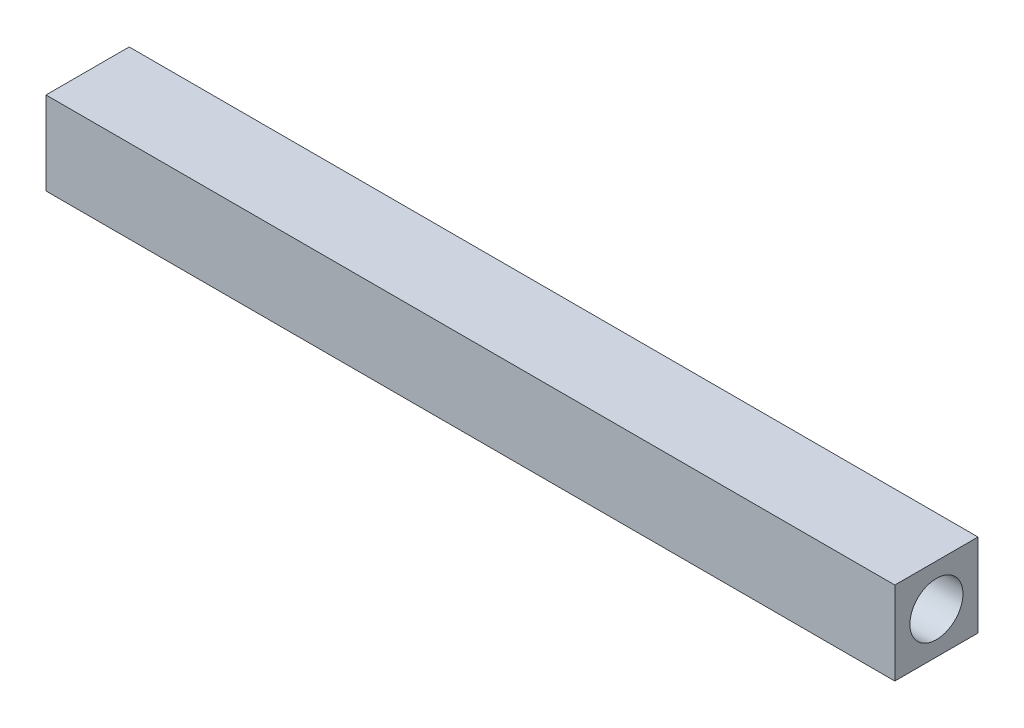
ISO-10303-21;
HEADER;
FILE_DESCRIPTION(('STEP AP214'),'2;1');
FILE_NAME('part.step','',(''),(''),'','','');
FILE_SCHEMA(('AUTOMOTIVE_DESIGN { 1 0 10303 214 1 1 1 1 }'));
ENDSEC;
DATA;
#1=APPLICATION_CONTEXT('core data for automotive mechanical design processes');
#2=APPLICATION_PROTOCOL_DEFINITION('international standard','automotive_design',2000,#1);
#3=PRODUCT_CONTEXT('',#1,'mechanical');
#4=PRODUCT('Part','Part','',(#3));
#5=PRODUCT_RELATED_PRODUCT_CATEGORY('part','',(#4));
#6=PRODUCT_DEFINITION_FORMATION('','',#4);
#7=PRODUCT_DEFINITION_CONTEXT('part definition',#1,'design');
#8=PRODUCT_DEFINITION('design','',#6,#7);
#9=PRODUCT_DEFINITION_SHAPE('','',#8);
#10=(LENGTH_UNIT() NAMED_UNIT(*) SI_UNIT(.MILLI.,.METRE.));
#11=(NAMED_UNIT(*) PLANE_ANGLE_UNIT() SI_UNIT($,.RADIAN.));
#12=(NAMED_UNIT(*) SI_UNIT($,.STERADIAN.) SOLID_ANGLE_UNIT());
#13=UNCERTAINTY_MEASURE_WITH_UNIT(LENGTH_MEASURE(1.E-05),#10,'distance_accuracy_value','');
#14=(GEOMETRIC_REPRESENTATION_CONTEXT(3) GLOBAL_UNCERTAINTY_ASSIGNED_CONTEXT((#13)) GLOBAL_UNIT_ASSIGNED_CONTEXT((#10,
#11,#12)) REPRESENTATION_CONTEXT('',''));
#15=CARTESIAN_POINT('',(0.,0.,0.));
#16=DIRECTION('',(0.,0.,1.));
#17=DIRECTION('',(1.,0.,0.));
#18=AXIS2_PLACEMENT_3D('',#15,#16,#17);
#19=CARTESIAN_POINT('',(50.8,0.,0.));
#20=DIRECTION('',(-1.,0.,0.));
#21=DIRECTION('',(0.,0.,1.));
#22=AXIS2_PLACEMENT_3D('',#19,#20,#21);
#23=PLANE('',#22);
#24=DIRECTION('',(0.,1.,0.));
#25=VECTOR('',#24,1.);
#26=CARTESIAN_POINT('',(50.8,-2.4892,-2.4892));
#27=LINE('',#26,#25);
#28=CARTESIAN_POINT('',(50.8,-2.4892,-2.4892));
#29=VERTEX_POINT('',#28);
#30=CARTESIAN_POINT('',(50.8,2.4892,-2.4892));
#31=VERTEX_POINT('',#30);
#32=EDGE_CURVE('E85',#29,#31,#27,.T.);
#33=ORIENTED_EDGE('',*,*,#32,.T.);
#34=DIRECTION('',(0.,0.,1.));
#35=VECTOR('',#34,1.);
#36=CARTESIAN_POINT('',(50.8,2.4892,2.4892));
#37=LINE('',#36,#35);
#38=CARTESIAN_POINT('',(50.8,2.4892,2.4892));
#39=VERTEX_POINT('',#38);
#40=EDGE_CURVE('E80',#31,#39,#37,.T.);
#41=ORIENTED_EDGE('',*,*,#40,.T.);
#42=DIRECTION('',(0.,-1.,0.));
#43=VECTOR('',#42,1.);
#44=CARTESIAN_POINT('',(50.8,-2.4892,2.4892));
#45=LINE('',#44,#43);
#46=CARTESIAN_POINT('',(50.8,-2.4892,2.4892));
#47=VERTEX_POINT('',#46);
#48=EDGE_CURVE('E83',#39,#47,#45,.T.);
#49=ORIENTED_EDGE('',*,*,#48,.T.);
#50=DIRECTION('',(0.,0.,-1.));
#51=VECTOR('',#50,1.);
#52=CARTESIAN_POINT('',(50.8,-2.4892,2.4892));
#53=LINE('',#52,#51);
#54=EDGE_CURVE('E50',#47,#29,#53,.T.);
#55=ORIENTED_EDGE('',*,*,#54,.T.);
#56=EDGE_LOOP('',(#33,#41,#49,#55));
#57=FACE_BOUND('',#56,.T.);
#58=CARTESIAN_POINT('',(50.8,0.,0.));
#59=DIRECTION('',(1.,0.,0.));
#60=DIRECTION('',(0.,0.,-1.));
#61=AXIS2_PLACEMENT_3D('',#58,#59,#60);
#62=CIRCLE('',#61,1.5875);
#63=CARTESIAN_POINT('',(50.8,0.,-1.5875));
#64=VERTEX_POINT('',#63);
#65=EDGE_CURVE('E100',#64,#64,#62,.T.);
#66=ORIENTED_EDGE('',*,*,#65,.F.);
#67=EDGE_LOOP('',(#66));
#68=FACE_BOUND('',#67,.T.);
#69=ADVANCED_FACE('F33',(#57,#68),#23,.F.);
#70=CARTESIAN_POINT('',(0.,0.,0.));
#71=DIRECTION('',(-1.,0.,0.));
#72=DIRECTION('',(0.,0.,1.));
#73=AXIS2_PLACEMENT_3D('',#70,#71,#72);
#74=PLANE('',#73);
#75=DIRECTION('',(0.,1.,0.));
#76=VECTOR('',#75,1.);
#77=CARTESIAN_POINT('',(0.,-2.4892,-2.4892));
#78=LINE('',#77,#76);
#79=CARTESIAN_POINT('',(0.,-2.4892,-2.4892));
#80=VERTEX_POINT('',#79);
#81=CARTESIAN_POINT('',(0.,2.4892,-2.4892));
#82=VERTEX_POINT('',#81);
#83=EDGE_CURVE('E97',#80,#82,#78,.T.);
#84=ORIENTED_EDGE('',*,*,#83,.F.);
#85=DIRECTION('',(0.,0.,-1.));
#86=VECTOR('',#85,1.);
#87=CARTESIAN_POINT('',(0.,-2.4892,2.4892));
#88=LINE('',#87,#86);
#89=CARTESIAN_POINT('',(0.,-2.4892,2.4892));
#90=VERTEX_POINT('',#89);
#91=EDGE_CURVE('E73',#90,#80,#88,.T.);
#92=ORIENTED_EDGE('',*,*,#91,.F.);
#93=DIRECTION('',(0.,-1.,0.));
#94=VECTOR('',#93,1.);
#95=CARTESIAN_POINT('',(0.,-2.4892,2.4892));
#96=LINE('',#95,#94);
#97=CARTESIAN_POINT('',(0.,2.4892,2.4892));
#98=VERTEX_POINT('',#97);
#99=EDGE_CURVE('E67',#98,#90,#96,.T.);
#100=ORIENTED_EDGE('',*,*,#99,.F.);
#101=DIRECTION('',(0.,0.,1.));
#102=VECTOR('',#101,1.);
#103=CARTESIAN_POINT('',(0.,2.4892,2.4892));
#104=LINE('',#103,#102);
#105=EDGE_CURVE('E89',#82,#98,#104,.T.);
#106=ORIENTED_EDGE('',*,*,#105,.F.);
#107=EDGE_LOOP('',(#84,#92,#100,#106));
#108=FACE_BOUND('',#107,.T.);
#109=CARTESIAN_POINT('',(0.,0.,0.));
#110=DIRECTION('',(1.,0.,0.));
#111=DIRECTION('',(0.,0.,-1.));
#112=AXIS2_PLACEMENT_3D('',#109,#110,#111);
#113=CIRCLE('',#112,1.5875);
#114=CARTESIAN_POINT('',(0.,0.,-1.5875));
#115=VERTEX_POINT('',#114);
#116=EDGE_CURVE('E112',#115,#115,#113,.T.);
#117=ORIENTED_EDGE('',*,*,#116,.T.);
#118=EDGE_LOOP('',(#117));
#119=FACE_BOUND('',#118,.T.);
#120=ADVANCED_FACE('F108',(#108,#119),#74,.T.);
#121=CARTESIAN_POINT('',(50.8,-2.4892,-2.4892));
#122=DIRECTION('',(0.,0.,1.));
#123=DIRECTION('',(1.,0.,0.));
#124=AXIS2_PLACEMENT_3D('',#121,#122,#123);
#125=PLANE('',#124);
#126=ORIENTED_EDGE('',*,*,#83,.T.);
#127=DIRECTION('',(-1.,0.,0.));
#128=VECTOR('',#127,1.);
#129=CARTESIAN_POINT('',(50.8,2.4892,-2.4892));
#130=LINE('',#129,#128);
#131=EDGE_CURVE('E11',#31,#82,#130,.T.);
#132=ORIENTED_EDGE('',*,*,#131,.F.);
#133=ORIENTED_EDGE('',*,*,#32,.F.);
#134=DIRECTION('',(-1.,0.,0.));
#135=VECTOR('',#134,1.);
#136=CARTESIAN_POINT('',(50.8,-2.4892,-2.4892));
#137=LINE('',#136,#135);
#138=EDGE_CURVE('E93',#29,#80,#137,.T.);
#139=ORIENTED_EDGE('',*,*,#138,.T.);
#140=EDGE_LOOP('',(#126,#132,#133,#139));
#141=FACE_BOUND('',#140,.T.);
#142=ADVANCED_FACE('F35',(#141),#125,.F.);
#143=CARTESIAN_POINT('',(50.8,2.4892,2.4892));
#144=DIRECTION('',(0.,-1.,0.));
#145=DIRECTION('',(0.,0.,-1.));
#146=AXIS2_PLACEMENT_3D('',#143,#144,#145);
#147=PLANE('',#146);
#148=ORIENTED_EDGE('',*,*,#105,.T.);
#149=DIRECTION('',(-1.,0.,0.));
#150=VECTOR('',#149,1.);
#151=CARTESIAN_POINT('',(50.8,2.4892,2.4892));
#152=LINE('',#151,#150);
#153=EDGE_CURVE('E42',#39,#98,#152,.T.);
#154=ORIENTED_EDGE('',*,*,#153,.F.);
#155=ORIENTED_EDGE('',*,*,#40,.F.);
#156=ORIENTED_EDGE('',*,*,#131,.T.);
#157=EDGE_LOOP('',(#148,#154,#155,#156));
#158=FACE_BOUND('',#157,.T.);
#159=ADVANCED_FACE('F88',(#158),#147,.F.);
#160=CARTESIAN_POINT('',(50.8,-2.4892,2.4892));
#161=DIRECTION('',(0.,0.,-1.));
#162=DIRECTION('',(-1.,0.,0.));
#163=AXIS2_PLACEMENT_3D('',#160,#161,#162);
#164=PLANE('',#163);
#165=ORIENTED_EDGE('',*,*,#99,.T.);
#166=DIRECTION('',(-1.,0.,0.));
#167=VECTOR('',#166,1.);
#168=CARTESIAN_POINT('',(50.8,-2.4892,2.4892));
#169=LINE('',#168,#167);
#170=EDGE_CURVE('E90',#47,#90,#169,.T.);
#171=ORIENTED_EDGE('',*,*,#170,.F.);
#172=ORIENTED_EDGE('',*,*,#48,.F.);
#173=ORIENTED_EDGE('',*,*,#153,.T.);
#174=EDGE_LOOP('',(#165,#171,#172,#173));
#175=FACE_BOUND('',#174,.T.);
#176=ADVANCED_FACE('F91',(#175),#164,.F.);
#177=CARTESIAN_POINT('',(50.8,-2.4892,2.4892));
#178=DIRECTION('',(0.,1.,0.));
#179=DIRECTION('',(0.,0.,1.));
#180=AXIS2_PLACEMENT_3D('',#177,#178,#179);
#181=PLANE('',#180);
#182=ORIENTED_EDGE('',*,*,#91,.T.);
#183=ORIENTED_EDGE('',*,*,#138,.F.);
#184=ORIENTED_EDGE('',*,*,#54,.F.);
#185=ORIENTED_EDGE('',*,*,#170,.T.);
#186=EDGE_LOOP('',(#182,#183,#184,#185));
#187=FACE_BOUND('',#186,.T.);
#188=ADVANCED_FACE('F105',(#187),#181,.F.);
#189=CARTESIAN_POINT('',(50.8,0.,0.));
#190=DIRECTION('',(-1.,0.,0.));
#191=DIRECTION('',(0.,0.,1.));
#192=AXIS2_PLACEMENT_3D('',#189,#190,#191);
#193=CYLINDRICAL_SURFACE('',#192,1.5875);
#194=ORIENTED_EDGE('',*,*,#65,.T.);
#195=EDGE_LOOP('',(#194));
#196=FACE_BOUND('',#195,.T.);
#197=ORIENTED_EDGE('',*,*,#116,.F.);
#198=EDGE_LOOP('',(#197));
#199=FACE_BOUND('',#198,.T.);
#200=ADVANCED_FACE('F118',(#196,#199),#193,.F.);
#201=CLOSED_SHELL('',(#69,#120,#142,#159,#176,#188,#200));
#202=MANIFOLD_SOLID_BREP('B2',#201);
#203=ADVANCED_BREP_SHAPE_REPRESENTATION('',(#18,#202),#14);
#204=SHAPE_DEFINITION_REPRESENTATION(#9,#203);
ENDSEC;
END-ISO-10303-21;
